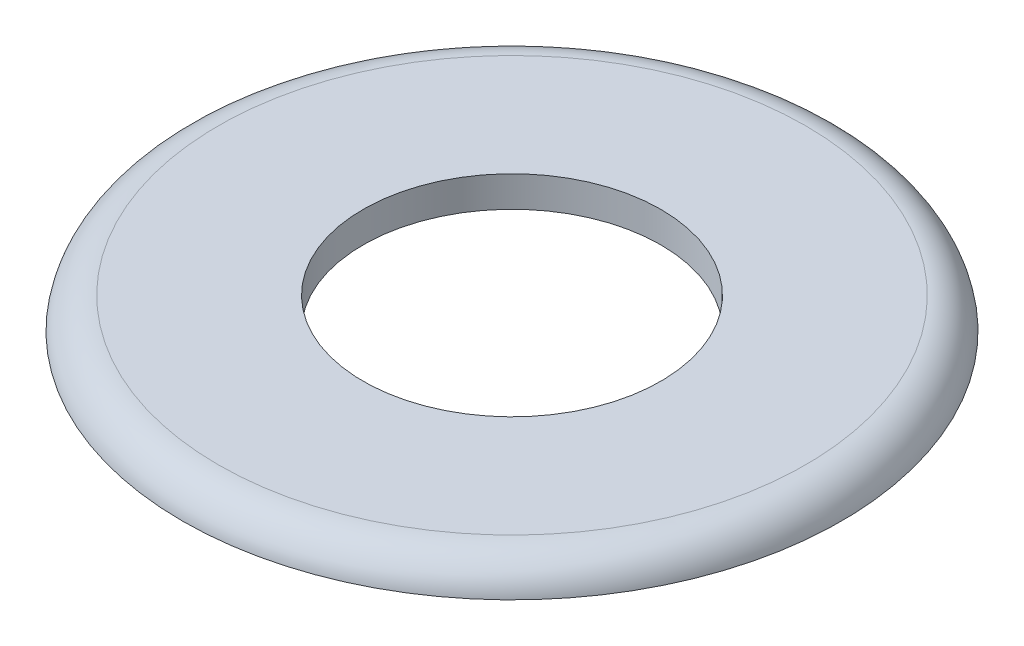
ISO-10303-21;
HEADER;
FILE_DESCRIPTION(('STEP AP214'),'2;1');
FILE_NAME('part.step','',(''),(''),'','','');
FILE_SCHEMA(('AUTOMOTIVE_DESIGN { 1 0 10303 214 1 1 1 1 }'));
ENDSEC;
DATA;
#1=APPLICATION_CONTEXT('core data for automotive mechanical design processes');
#2=APPLICATION_PROTOCOL_DEFINITION('international standard','automotive_design',2000,#1);
#3=PRODUCT_CONTEXT('',#1,'mechanical');
#4=PRODUCT('Part','Part','',(#3));
#5=PRODUCT_RELATED_PRODUCT_CATEGORY('part','',(#4));
#6=PRODUCT_DEFINITION_FORMATION('','',#4);
#7=PRODUCT_DEFINITION_CONTEXT('part definition',#1,'design');
#8=PRODUCT_DEFINITION('design','',#6,#7);
#9=PRODUCT_DEFINITION_SHAPE('','',#8);
#10=(LENGTH_UNIT() NAMED_UNIT(*) SI_UNIT(.MILLI.,.METRE.));
#11=(NAMED_UNIT(*) PLANE_ANGLE_UNIT() SI_UNIT($,.RADIAN.));
#12=(NAMED_UNIT(*) SI_UNIT($,.STERADIAN.) SOLID_ANGLE_UNIT());
#13=UNCERTAINTY_MEASURE_WITH_UNIT(LENGTH_MEASURE(1.E-05),#10,'distance_accuracy_value','');
#14=(GEOMETRIC_REPRESENTATION_CONTEXT(3) GLOBAL_UNCERTAINTY_ASSIGNED_CONTEXT((#13)) GLOBAL_UNIT_ASSIGNED_CONTEXT((#10,
#11,#12)) REPRESENTATION_CONTEXT('',''));
#15=CARTESIAN_POINT('',(0.,0.,0.));
#16=DIRECTION('',(0.,0.,1.));
#17=DIRECTION('',(1.,0.,0.));
#18=AXIS2_PLACEMENT_3D('',#15,#16,#17);
#19=CARTESIAN_POINT('',(0.,4.137025,-4.03489583333334));
#20=DIRECTION('',(0.,1.,0.));
#21=DIRECTION('',(0.,0.,1.));
#22=AXIS2_PLACEMENT_3D('',#19,#20,#21);
#23=PLANE('',#22);
#24=CARTESIAN_POINT('',(0.,4.137025,0.));
#25=DIRECTION('',(0.,-1.,0.));
#26=DIRECTION('',(0.,0.,-1.));
#27=AXIS2_PLACEMENT_3D('',#24,#25,#26);
#28=CIRCLE('',#27,4.03489583333334);
#29=CARTESIAN_POINT('',(0.,4.137025,-4.03489583333334));
#30=VERTEX_POINT('',#29);
#31=CARTESIAN_POINT('',(0.,4.137025,4.03489583333334));
#32=VERTEX_POINT('',#31);
#33=EDGE_CURVE('E34',#30,#32,#28,.T.);
#34=ORIENTED_EDGE('',*,*,#33,.F.);
#35=CARTESIAN_POINT('',(0.,4.137025,0.));
#36=DIRECTION('',(0.,-1.,0.));
#37=DIRECTION('',(0.,0.,1.));
#38=AXIS2_PLACEMENT_3D('',#35,#36,#37);
#39=CIRCLE('',#38,4.03489583333334);
#40=EDGE_CURVE('E40',#32,#30,#39,.T.);
#41=ORIENTED_EDGE('',*,*,#40,.F.);
#42=EDGE_LOOP('',(#34,#41));
#43=FACE_BOUND('',#42,.T.);
#44=CARTESIAN_POINT('',(0.,4.137025,0.));
#45=DIRECTION('',(0.,-1.,0.));
#46=DIRECTION('',(0.,0.,-1.));
#47=AXIS2_PLACEMENT_3D('',#44,#45,#46);
#48=CIRCLE('',#47,2.04542483721734);
#49=CARTESIAN_POINT('',(0.,4.137025,-2.04542483721734));
#50=VERTEX_POINT('',#49);
#51=EDGE_CURVE('E45',#50,#50,#48,.T.);
#52=ORIENTED_EDGE('',*,*,#51,.T.);
#53=EDGE_LOOP('',(#52));
#54=FACE_BOUND('',#53,.T.);
#55=ADVANCED_FACE('F17',(#43,#54),#23,.T.);
#56=CARTESIAN_POINT('',(0.,3.63802083333334,0.));
#57=DIRECTION('',(0.,-1.,0.));
#58=DIRECTION('',(0.,0.,-1.));
#59=AXIS2_PLACEMENT_3D('',#56,#57,#58);
#60=TOROIDAL_SURFACE('',#59,4.03489583333334,0.499004166666668);
#61=ORIENTED_EDGE('',*,*,#33,.T.);
#62=ORIENTED_EDGE('',*,*,#40,.T.);
#63=EDGE_LOOP('',(#61,#62));
#64=FACE_BOUND('',#63,.T.);
#65=CARTESIAN_POINT('',(0.,3.71422083333334,0.));
#66=DIRECTION('',(0.,-1.,0.));
#67=DIRECTION('',(0.,0.,-1.));
#68=AXIS2_PLACEMENT_3D('',#65,#66,#67);
#69=CIRCLE('',#68,4.52804765412557);
#70=CARTESIAN_POINT('',(0.,3.71422083333334,-4.52804765412557));
#71=VERTEX_POINT('',#70);
#72=EDGE_CURVE('E27',#71,#71,#69,.T.);
#73=ORIENTED_EDGE('',*,*,#72,.F.);
#74=EDGE_LOOP('',(#73));
#75=FACE_BOUND('',#74,.T.);
#76=ADVANCED_FACE('F38',(#64,#75),#60,.T.);
#77=CARTESIAN_POINT('',(0.,3.71422083333334,0.));
#78=DIRECTION('',(0.,-1.,0.));
#79=DIRECTION('',(0.,0.,-1.));
#80=AXIS2_PLACEMENT_3D('',#77,#78,#79);
#81=CYLINDRICAL_SURFACE('',#80,2.04542483721734);
#82=CARTESIAN_POINT('',(0.,3.71422083333333,0.));
#83=DIRECTION('',(0.,-1.,0.));
#84=DIRECTION('',(0.,0.,-1.));
#85=AXIS2_PLACEMENT_3D('',#82,#83,#84);
#86=CIRCLE('',#85,2.04542483721734);
#87=CARTESIAN_POINT('',(0.,3.71422083333333,-2.04542483721734));
#88=VERTEX_POINT('',#87);
#89=EDGE_CURVE('E11',#88,#88,#86,.F.);
#90=ORIENTED_EDGE('',*,*,#89,.F.);
#91=EDGE_LOOP('',(#90));
#92=FACE_BOUND('',#91,.T.);
#93=ORIENTED_EDGE('',*,*,#51,.F.);
#94=EDGE_LOOP('',(#93));
#95=FACE_BOUND('',#94,.T.);
#96=ADVANCED_FACE('F70',(#92,#95),#81,.F.);
#97=CARTESIAN_POINT('',(0.,3.71422083333334,-2.04542483721734));
#98=DIRECTION('',(0.,-1.,0.));
#99=DIRECTION('',(0.,0.,-1.));
#100=AXIS2_PLACEMENT_3D('',#97,#98,#99);
#101=PLANE('',#100);
#102=ORIENTED_EDGE('',*,*,#89,.T.);
#103=EDGE_LOOP('',(#102));
#104=FACE_BOUND('',#103,.T.);
#105=ORIENTED_EDGE('',*,*,#72,.T.);
#106=EDGE_LOOP('',(#105));
#107=FACE_BOUND('',#106,.T.);
#108=ADVANCED_FACE('F75',(#104,#107),#101,.T.);
#109=CLOSED_SHELL('',(#55,#76,#96,#108));
#110=MANIFOLD_SOLID_BREP('B1',#109);
#111=ADVANCED_BREP_SHAPE_REPRESENTATION('',(#18,#110),#14);
#112=SHAPE_DEFINITION_REPRESENTATION(#9,#111);
ENDSEC;
END-ISO-10303-21;
